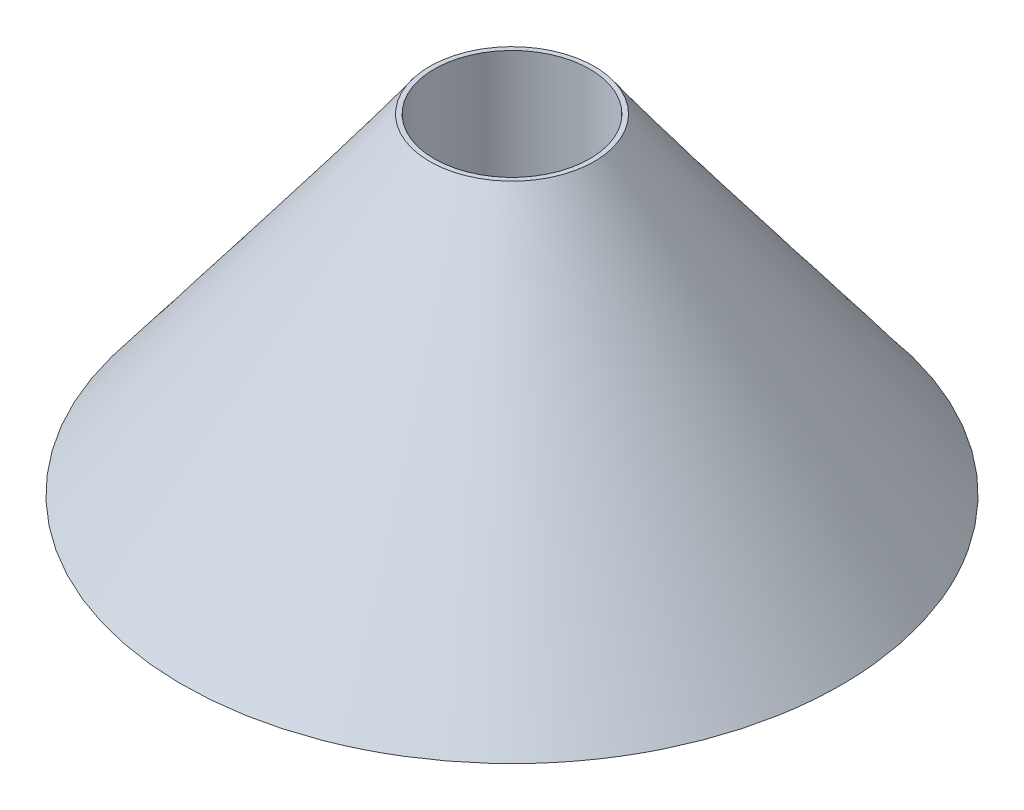
ISO-10303-21;
HEADER;
FILE_DESCRIPTION(('STEP AP214'),'2;1');
FILE_NAME('part.step','',(''),(''),'','','');
FILE_SCHEMA(('AUTOMOTIVE_DESIGN { 1 0 10303 214 1 1 1 1 }'));
ENDSEC;
DATA;
#1=APPLICATION_CONTEXT('core data for automotive mechanical design processes');
#2=APPLICATION_PROTOCOL_DEFINITION('international standard','automotive_design',2000,#1);
#3=PRODUCT_CONTEXT('',#1,'mechanical');
#4=PRODUCT('Part','Part','',(#3));
#5=PRODUCT_RELATED_PRODUCT_CATEGORY('part','',(#4));
#6=PRODUCT_DEFINITION_FORMATION('','',#4);
#7=PRODUCT_DEFINITION_CONTEXT('part definition',#1,'design');
#8=PRODUCT_DEFINITION('design','',#6,#7);
#9=PRODUCT_DEFINITION_SHAPE('','',#8);
#10=(LENGTH_UNIT() NAMED_UNIT(*) SI_UNIT(.MILLI.,.METRE.));
#11=(NAMED_UNIT(*) PLANE_ANGLE_UNIT() SI_UNIT($,.RADIAN.));
#12=(NAMED_UNIT(*) SI_UNIT($,.STERADIAN.) SOLID_ANGLE_UNIT());
#13=UNCERTAINTY_MEASURE_WITH_UNIT(LENGTH_MEASURE(1.E-05),#10,'distance_accuracy_value','');
#14=(GEOMETRIC_REPRESENTATION_CONTEXT(3) GLOBAL_UNCERTAINTY_ASSIGNED_CONTEXT((#13)) GLOBAL_UNIT_ASSIGNED_CONTEXT((#10,
#11,#12)) REPRESENTATION_CONTEXT('',''));
#15=CARTESIAN_POINT('',(0.,0.,0.));
#16=DIRECTION('',(0.,0.,1.));
#17=DIRECTION('',(1.,0.,0.));
#18=AXIS2_PLACEMENT_3D('',#15,#16,#17);
#19=CARTESIAN_POINT('',(0.,4.,0.));
#20=DIRECTION('',(0.,1.,0.));
#21=DIRECTION('',(0.,0.,1.));
#22=AXIS2_PLACEMENT_3D('',#19,#20,#21);
#23=PLANE('',#22);
#24=CARTESIAN_POINT('',(0.,4.,0.));
#25=DIRECTION('',(0.,1.,0.));
#26=DIRECTION('',(0.,0.,1.));
#27=AXIS2_PLACEMENT_3D('',#24,#25,#26);
#28=CIRCLE('',#27,0.943750000000028);
#29=CARTESIAN_POINT('',(0.,4.,0.943750000000028));
#30=VERTEX_POINT('',#29);
#31=EDGE_CURVE('E122',#30,#30,#28,.T.);
#32=ORIENTED_EDGE('',*,*,#31,.F.);
#33=EDGE_LOOP('',(#32));
#34=FACE_BOUND('',#33,.T.);
#35=CARTESIAN_POINT('',(0.,4.,0.));
#36=DIRECTION('',(0.,1.,0.));
#37=DIRECTION('',(0.,0.,1.));
#38=AXIS2_PLACEMENT_3D('',#35,#36,#37);
#39=CIRCLE('',#38,1.);
#40=CARTESIAN_POINT('',(-0.800815002615857,4.,-0.598911789486036));
#41=VERTEX_POINT('',#40);
#42=EDGE_CURVE('E11',#41,#41,#39,.T.);
#43=ORIENTED_EDGE('',*,*,#42,.T.);
#44=EDGE_LOOP('',(#43));
#45=FACE_BOUND('',#44,.T.);
#46=ADVANCED_FACE('F45',(#34,#45),#23,.T.);
#47=CARTESIAN_POINT('',(0.,0.,0.));
#48=DIRECTION('',(0.,1.,0.));
#49=DIRECTION('',(0.,0.,1.));
#50=AXIS2_PLACEMENT_3D('',#47,#48,#49);
#51=PLANE('',#50);
#52=CARTESIAN_POINT('',(0.,0.,0.));
#53=DIRECTION('',(0.,1.,0.));
#54=DIRECTION('',(0.,0.,1.));
#55=AXIS2_PLACEMENT_3D('',#52,#53,#54);
#56=CIRCLE('',#55,4.);
#57=CARTESIAN_POINT('',(-3.80110747600943,0.,-1.24562512652291));
#58=VERTEX_POINT('',#57);
#59=EDGE_CURVE('E54',#58,#58,#56,.T.);
#60=ORIENTED_EDGE('',*,*,#59,.F.);
#61=EDGE_LOOP('',(#60));
#62=FACE_BOUND('',#61,.T.);
#63=ADVANCED_FACE('F79',(#62),#51,.F.);
#64=CARTESIAN_POINT('',(-3.80110747600943,0.,-1.24562512652291));
#65=CARTESIAN_POINT('',(-0.800815002615857,4.,-0.598911789486036));
#66=CARTESIAN_POINT('',(-6.29235772905525,0.,6.35658982549594));
#67=CARTESIAN_POINT('',(-1.99863858158793,4.,1.00271821574568));
#68=CARTESIAN_POINT('',(1.3098572229636,0.,8.84784007854176));
#69=CARTESIAN_POINT('',(-0.397008576356214,4.,2.20054179471775));
#70=CARTESIAN_POINT('',(3.80110747600943,0.,1.24562512652292));
#71=CARTESIAN_POINT('',(0.800815002615857,4.,0.598911789486036));
#72=CARTESIAN_POINT('',(6.29235772905526,0.,-6.35658982549594));
#73=CARTESIAN_POINT('',(1.99863858158793,4.,-1.00271821574568));
#74=CARTESIAN_POINT('',(-1.3098572229636,0.,-8.84784007854177));
#75=CARTESIAN_POINT('',(0.397008576356214,4.,-2.20054179471775));
#76=CARTESIAN_POINT('',(-3.80110747600943,0.,-1.24562512652291));
#77=CARTESIAN_POINT('',(-0.800815002615857,4.,-0.598911789486036));
#78=(BOUNDED_SURFACE() B_SPLINE_SURFACE(3,1,((#64,#65),(#66,#67),(#68,#69),(#70,#71),(#72,#73),
(#74,#75),(#76,#77)),.UNSPECIFIED.,.T.,.F.,.F.) B_SPLINE_SURFACE_WITH_KNOTS((4,3,4),(2,2),(0.,
0.5,1.),(0.,1.),.UNSPECIFIED.) GEOMETRIC_REPRESENTATION_ITEM() RATIONAL_B_SPLINE_SURFACE(((1.,
1.),(0.333333333333334,0.333333333333333),(0.333333333333334,0.333333333333333),(1.,1.),
(0.333333333333333,0.333333333333333),(0.333333333333333,0.333333333333333),(1.,1.))) REPRESENTATION_ITEM('') SURFACE());
#79=CARTESIAN_POINT('',(-3.80110747600943,0.,-1.24562512652291));
#80=CARTESIAN_POINT('',(-3.76985442941158,0.0416666666666669,-1.23888852926211));
#81=CARTESIAN_POINT('',(-3.73860138281373,0.0833333333333335,-1.23215193200131));
#82=CARTESIAN_POINT('',(-3.67609528961803,0.166666666666667,-1.21867873747971));
#83=CARTESIAN_POINT('',(-3.64484224302018,0.208333333333333,-1.21194214021891));
#84=CARTESIAN_POINT('',(-3.58233614982448,0.291666666666667,-1.19846894569731));
#85=CARTESIAN_POINT('',(-3.55108310322663,0.333333333333333,-1.19173234843651));
#86=CARTESIAN_POINT('',(-3.48857701003093,0.416666666666667,-1.1782591539149));
#87=CARTESIAN_POINT('',(-3.45732396343308,0.458333333333333,-1.1715225566541));
#88=CARTESIAN_POINT('',(-3.39481787023738,0.541666666666667,-1.1580493621325));
#89=CARTESIAN_POINT('',(-3.36356482363953,0.583333333333333,-1.1513127648717));
#90=CARTESIAN_POINT('',(-3.30105873044383,0.666666666666667,-1.1378395703501));
#91=CARTESIAN_POINT('',(-3.26980568384599,0.708333333333333,-1.1311029730893));
#92=CARTESIAN_POINT('',(-3.20729959065029,0.791666666666667,-1.1176297785677));
#93=CARTESIAN_POINT('',(-3.17604654405244,0.833333333333333,-1.1108931813069));
#94=CARTESIAN_POINT('',(-3.11354045085674,0.916666666666667,-1.09741998678529));
#95=CARTESIAN_POINT('',(-3.08228740425889,0.958333333333333,-1.09068338952449));
#96=CARTESIAN_POINT('',(-3.01978131106319,1.04166666666667,-1.07721019500289));
#97=CARTESIAN_POINT('',(-2.98852826446534,1.08333333333333,-1.07047359774209));
#98=CARTESIAN_POINT('',(-2.92602217126964,1.16666666666667,-1.05700040322049));
#99=CARTESIAN_POINT('',(-2.89476912467179,1.20833333333333,-1.05026380595969));
#100=CARTESIAN_POINT('',(-2.83226303147609,1.29166666666667,-1.03679061143809));
#101=CARTESIAN_POINT('',(-2.80100998487824,1.33333333333333,-1.03005401417729));
#102=CARTESIAN_POINT('',(-2.73850389168254,1.41666666666667,-1.01658081965569));
#103=CARTESIAN_POINT('',(-2.70725084508469,1.45833333333333,-1.00984422239488));
#104=CARTESIAN_POINT('',(-2.64474475188899,1.54166666666667,-0.996371027873283));
#105=CARTESIAN_POINT('',(-2.61349170529114,1.58333333333333,-0.989634430612482));
#106=CARTESIAN_POINT('',(-2.55098561209544,1.66666666666667,-0.97616123609088));
#107=CARTESIAN_POINT('',(-2.51973256549759,1.70833333333333,-0.96942463883008));
#108=CARTESIAN_POINT('',(-2.45722647230189,1.79166666666667,-0.955951444308478));
#109=CARTESIAN_POINT('',(-2.42597342570404,1.83333333333333,-0.949214847047677));
#110=CARTESIAN_POINT('',(-2.36346733250834,1.91666666666667,-0.935741652526076));
#111=CARTESIAN_POINT('',(-2.33221428591049,1.95833333333333,-0.929005055265275));
#112=CARTESIAN_POINT('',(-2.26970819271479,2.04166666666667,-0.915531860743673));
#113=CARTESIAN_POINT('',(-2.23845514611694,2.08333333333333,-0.908795263482872));
#114=CARTESIAN_POINT('',(-2.17594905292124,2.16666666666667,-0.895322068961271));
#115=CARTESIAN_POINT('',(-2.14469600632339,2.20833333333333,-0.88858547170047));
#116=CARTESIAN_POINT('',(-2.0821899131277,2.29166666666667,-0.875112277178868));
#117=CARTESIAN_POINT('',(-2.05093686652985,2.33333333333333,-0.868375679918068));
#118=CARTESIAN_POINT('',(-1.98843077333415,2.41666666666667,-0.854902485396466));
#119=CARTESIAN_POINT('',(-1.9571777267363,2.45833333333333,-0.848165888135665));
#120=CARTESIAN_POINT('',(-1.8946716335406,2.54166666666667,-0.834692693614064));
#121=CARTESIAN_POINT('',(-1.86341858694275,2.58333333333333,-0.827956096353263));
#122=CARTESIAN_POINT('',(-1.80091249374705,2.66666666666667,-0.814482901831661));
#123=CARTESIAN_POINT('',(-1.7696594471492,2.70833333333333,-0.80774630457086));
#124=CARTESIAN_POINT('',(-1.7071533539535,2.79166666666667,-0.794273110049259));
#125=CARTESIAN_POINT('',(-1.67590030735565,2.83333333333333,-0.787536512788458));
#126=CARTESIAN_POINT('',(-1.61339421415995,2.91666666666667,-0.774063318266856));
#127=CARTESIAN_POINT('',(-1.5821411675621,2.95833333333333,-0.767326721006055));
#128=CARTESIAN_POINT('',(-1.5196350743664,3.04166666666667,-0.753853526484454));
#129=CARTESIAN_POINT('',(-1.48838202776855,3.08333333333333,-0.747116929223653));
#130=CARTESIAN_POINT('',(-1.42587593457285,3.16666666666667,-0.733643734702052));
#131=CARTESIAN_POINT('',(-1.394622887975,3.20833333333333,-0.726907137441251));
#132=CARTESIAN_POINT('',(-1.3321167947793,3.29166666666667,-0.713433942919649));
#133=CARTESIAN_POINT('',(-1.30086374818145,3.33333333333333,-0.706697345658848));
#134=CARTESIAN_POINT('',(-1.23835765498575,3.41666666666667,-0.693224151137247));
#135=CARTESIAN_POINT('',(-1.2071046083879,3.45833333333333,-0.686487553876446));
#136=CARTESIAN_POINT('',(-1.1445985151922,3.54166666666667,-0.673014359354844));
#137=CARTESIAN_POINT('',(-1.11334546859435,3.58333333333333,-0.666277762094044));
#138=CARTESIAN_POINT('',(-1.05083937539865,3.66666666666667,-0.652804567572442));
#139=CARTESIAN_POINT('',(-1.0195863288008,3.70833333333333,-0.646067970311641));
#140=CARTESIAN_POINT('',(-0.957080235605105,3.79166666666667,-0.63259477579004));
#141=CARTESIAN_POINT('',(-0.925827189007256,3.83333333333333,-0.625858178529239));
#142=CARTESIAN_POINT('',(-0.863321095811556,3.91666666666667,-0.612384984007637));
#143=CARTESIAN_POINT('',(-0.832068049213706,3.95833333333333,-0.605648386746836));
#144=CARTESIAN_POINT('',(-0.800815002615857,4.,-0.598911789486036));
#145=B_SPLINE_CURVE_WITH_KNOTS('',3,(#79,#80,#81,#82,#83,#84,#85,#86,#87,#88,#89,#90,#91,#92,
#93,#94,#95,#96,#97,#98,#99,#100,#101,#102,#103,#104,#105,#106,#107,#108,#109,#110,#111,#112,
#113,#114,#115,#116,#117,#118,#119,#120,#121,#122,#123,#124,#125,#126,#127,#128,#129,#130,#131,
#132,#133,#134,#135,#136,#137,#138,#139,#140,#141,#142,#143,#144),.UNSPECIFIED.,.F.,.F.,(4,2,2,
2,2,2,2,2,2,2,2,2,2,2,2,2,2,2,2,2,2,2,2,2,2,2,2,2,2,2,2,2,4),(0.,0.157557011836079,
0.315114023672158,0.472671035508237,0.630228047344316,0.787785059180395,0.945342071016474,
1.10289908285255,1.26045609468863,1.41801310652471,1.57557011836079,1.73312713019687,
1.89068414203295,2.04824115386903,2.20579816570511,2.36335517754119,2.52091218937726,
2.67846920121334,2.83602621304942,2.9935832248855,3.15114023672158,3.30869724855766,
3.46625426039374,3.62381127222982,3.7813682840659,3.93892529590198,4.09648230773805,
4.25403931957413,4.41159633141021,4.56915334324629,4.72671035508237,4.88426736691845,
5.04182437875453),.UNSPECIFIED.);
#146=EDGE_CURVE('BSEAM88',#58,#41,#145,.T.);
#147=ORIENTED_EDGE('',*,*,#59,.T.);
#148=ORIENTED_EDGE('',*,*,#42,.F.);
#149=ORIENTED_EDGE('',*,*,#146,.T.);
#150=ORIENTED_EDGE('',*,*,#146,.F.);
#151=EDGE_LOOP('',(#147,#149,#148,#150));
#152=FACE_BOUND('',#151,.T.);
#153=ADVANCED_FACE('F88',(#152),#78,.T.);
#154=CARTESIAN_POINT('',(0.,2.,0.));
#155=DIRECTION('',(0.,1.,0.));
#156=DIRECTION('',(0.,0.,1.));
#157=AXIS2_PLACEMENT_3D('',#154,#155,#156);
#158=CYLINDRICAL_SURFACE('',#157,0.943750000000028);
#159=CARTESIAN_POINT('',(0.,2.,0.));
#160=DIRECTION('',(0.,1.,0.));
#161=DIRECTION('',(0.,0.,1.));
#162=AXIS2_PLACEMENT_3D('',#159,#160,#161);
#163=CIRCLE('',#162,0.943750000000028);
#164=CARTESIAN_POINT('',(0.,2.,0.943750000000028));
#165=VERTEX_POINT('',#164);
#166=EDGE_CURVE('E60',#165,#165,#163,.T.);
#167=ORIENTED_EDGE('',*,*,#166,.F.);
#168=EDGE_LOOP('',(#167));
#169=FACE_BOUND('',#168,.T.);
#170=ORIENTED_EDGE('',*,*,#31,.T.);
#171=EDGE_LOOP('',(#170));
#172=FACE_BOUND('',#171,.T.);
#173=ADVANCED_FACE('F90',(#169,#172),#158,.F.);
#174=CARTESIAN_POINT('',(0.,2.,0.));
#175=DIRECTION('',(0.,1.,0.));
#176=DIRECTION('',(0.,0.,1.));
#177=AXIS2_PLACEMENT_3D('',#174,#175,#176);
#178=PLANE('',#177);
#179=ORIENTED_EDGE('',*,*,#166,.T.);
#180=EDGE_LOOP('',(#179));
#181=FACE_BOUND('',#180,.T.);
#182=ADVANCED_FACE('F130',(#181),#178,.T.);
#183=CLOSED_SHELL('',(#46,#63,#153,#173,#182));
#184=MANIFOLD_SOLID_BREP('B2',#183);
#185=ADVANCED_BREP_SHAPE_REPRESENTATION('',(#18,#184),#14);
#186=SHAPE_DEFINITION_REPRESENTATION(#9,#185);
ENDSEC;
END-ISO-10303-21;
